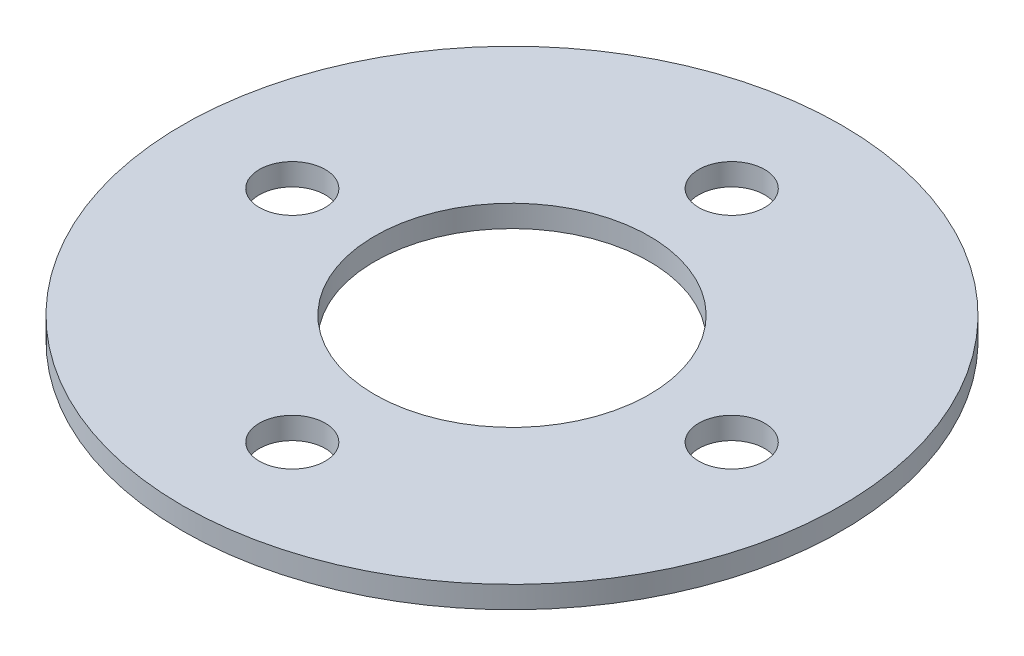
ISO-10303-21;
HEADER;
FILE_DESCRIPTION(('STEP AP214'),'2;1');
FILE_NAME('part.step','',(''),(''),'','','');
FILE_SCHEMA(('AUTOMOTIVE_DESIGN { 1 0 10303 214 1 1 1 1 }'));
ENDSEC;
DATA;
#1=APPLICATION_CONTEXT('core data for automotive mechanical design processes');
#2=APPLICATION_PROTOCOL_DEFINITION('international standard','automotive_design',2000,#1);
#3=PRODUCT_CONTEXT('',#1,'mechanical');
#4=PRODUCT('Part','Part','',(#3));
#5=PRODUCT_RELATED_PRODUCT_CATEGORY('part','',(#4));
#6=PRODUCT_DEFINITION_FORMATION('','',#4);
#7=PRODUCT_DEFINITION_CONTEXT('part definition',#1,'design');
#8=PRODUCT_DEFINITION('design','',#6,#7);
#9=PRODUCT_DEFINITION_SHAPE('','',#8);
#10=(LENGTH_UNIT() NAMED_UNIT(*) SI_UNIT(.MILLI.,.METRE.));
#11=(NAMED_UNIT(*) PLANE_ANGLE_UNIT() SI_UNIT($,.RADIAN.));
#12=(NAMED_UNIT(*) SI_UNIT($,.STERADIAN.) SOLID_ANGLE_UNIT());
#13=UNCERTAINTY_MEASURE_WITH_UNIT(LENGTH_MEASURE(1.E-05),#10,'distance_accuracy_value','');
#14=(GEOMETRIC_REPRESENTATION_CONTEXT(3) GLOBAL_UNCERTAINTY_ASSIGNED_CONTEXT((#13)) GLOBAL_UNIT_ASSIGNED_CONTEXT((#10,
#11,#12)) REPRESENTATION_CONTEXT('',''));
#15=CARTESIAN_POINT('',(0.,0.,0.));
#16=DIRECTION('',(0.,0.,1.));
#17=DIRECTION('',(1.,0.,0.));
#18=AXIS2_PLACEMENT_3D('',#15,#16,#17);
#19=CARTESIAN_POINT('',(0.,1.,0.));
#20=DIRECTION('',(0.,1.,0.));
#21=DIRECTION('',(0.,0.,1.));
#22=AXIS2_PLACEMENT_3D('',#19,#20,#21);
#23=PLANE('',#22);
#24=CARTESIAN_POINT('',(0.,1.,10.));
#25=DIRECTION('',(0.,1.,0.));
#26=DIRECTION('',(0.,0.,1.));
#27=AXIS2_PLACEMENT_3D('',#24,#25,#26);
#28=CIRCLE('',#27,1.5);
#29=CARTESIAN_POINT('',(0.,1.,11.5));
#30=VERTEX_POINT('',#29);
#31=EDGE_CURVE('E64',#30,#30,#28,.T.);
#32=ORIENTED_EDGE('',*,*,#31,.F.);
#33=EDGE_LOOP('',(#32));
#34=FACE_BOUND('',#33,.T.);
#35=CARTESIAN_POINT('',(0.,1.,-10.));
#36=DIRECTION('',(0.,1.,0.));
#37=DIRECTION('',(0.,0.,1.));
#38=AXIS2_PLACEMENT_3D('',#35,#36,#37);
#39=CIRCLE('',#38,1.5);
#40=CARTESIAN_POINT('',(0.,1.,-8.5));
#41=VERTEX_POINT('',#40);
#42=EDGE_CURVE('E52',#41,#41,#39,.T.);
#43=ORIENTED_EDGE('',*,*,#42,.F.);
#44=EDGE_LOOP('',(#43));
#45=FACE_BOUND('',#44,.T.);
#46=CARTESIAN_POINT('',(0.,1.,0.));
#47=DIRECTION('',(0.,1.,0.));
#48=DIRECTION('',(0.,0.,1.));
#49=AXIS2_PLACEMENT_3D('',#46,#47,#48);
#50=CIRCLE('',#49,15.);
#51=CARTESIAN_POINT('',(0.,1.,15.));
#52=VERTEX_POINT('',#51);
#53=EDGE_CURVE('E10',#52,#52,#50,.T.);
#54=ORIENTED_EDGE('',*,*,#53,.T.);
#55=EDGE_LOOP('',(#54));
#56=FACE_BOUND('',#55,.T.);
#57=CARTESIAN_POINT('',(0.,1.,0.));
#58=DIRECTION('',(0.,1.,0.));
#59=DIRECTION('',(0.,0.,1.));
#60=AXIS2_PLACEMENT_3D('',#57,#58,#59);
#61=CIRCLE('',#60,6.25);
#62=CARTESIAN_POINT('',(0.,1.,6.25));
#63=VERTEX_POINT('',#62);
#64=EDGE_CURVE('E47',#63,#63,#61,.T.);
#65=ORIENTED_EDGE('',*,*,#64,.F.);
#66=EDGE_LOOP('',(#65));
#67=FACE_BOUND('',#66,.T.);
#68=CARTESIAN_POINT('',(10.,1.,0.));
#69=DIRECTION('',(0.,1.,0.));
#70=DIRECTION('',(0.,0.,1.));
#71=AXIS2_PLACEMENT_3D('',#68,#69,#70);
#72=CIRCLE('',#71,1.5);
#73=CARTESIAN_POINT('',(10.,1.,1.50000000000003));
#74=VERTEX_POINT('',#73);
#75=EDGE_CURVE('E58',#74,#74,#72,.T.);
#76=ORIENTED_EDGE('',*,*,#75,.F.);
#77=EDGE_LOOP('',(#76));
#78=FACE_BOUND('',#77,.T.);
#79=CARTESIAN_POINT('',(-10.,1.,-1.04744440165294E-13));
#80=DIRECTION('',(0.,1.,0.));
#81=DIRECTION('',(0.,0.,1.));
#82=AXIS2_PLACEMENT_3D('',#79,#80,#81);
#83=CIRCLE('',#82,1.5);
#84=CARTESIAN_POINT('',(-10.,1.,1.49999999999989));
#85=VERTEX_POINT('',#84);
#86=EDGE_CURVE('E70',#85,#85,#83,.T.);
#87=ORIENTED_EDGE('',*,*,#86,.F.);
#88=EDGE_LOOP('',(#87));
#89=FACE_BOUND('',#88,.T.);
#90=ADVANCED_FACE('F36',(#34,#45,#56,#67,#78,#89),#23,.T.);
#91=CARTESIAN_POINT('',(0.,0.,0.));
#92=DIRECTION('',(0.,1.,0.));
#93=DIRECTION('',(0.,0.,1.));
#94=AXIS2_PLACEMENT_3D('',#91,#92,#93);
#95=PLANE('',#94);
#96=CARTESIAN_POINT('',(0.,0.,0.));
#97=DIRECTION('',(0.,1.,0.));
#98=DIRECTION('',(0.,0.,1.));
#99=AXIS2_PLACEMENT_3D('',#96,#97,#98);
#100=CIRCLE('',#99,15.);
#101=CARTESIAN_POINT('',(0.,0.,15.));
#102=VERTEX_POINT('',#101);
#103=EDGE_CURVE('E40',#102,#102,#100,.T.);
#104=ORIENTED_EDGE('',*,*,#103,.F.);
#105=EDGE_LOOP('',(#104));
#106=FACE_BOUND('',#105,.T.);
#107=CARTESIAN_POINT('',(0.,0.,0.));
#108=DIRECTION('',(0.,1.,0.));
#109=DIRECTION('',(0.,0.,1.));
#110=AXIS2_PLACEMENT_3D('',#107,#108,#109);
#111=CIRCLE('',#110,6.25);
#112=CARTESIAN_POINT('',(0.,0.,6.25));
#113=VERTEX_POINT('',#112);
#114=EDGE_CURVE('E49',#113,#113,#111,.T.);
#115=ORIENTED_EDGE('',*,*,#114,.T.);
#116=EDGE_LOOP('',(#115));
#117=FACE_BOUND('',#116,.T.);
#118=CARTESIAN_POINT('',(0.,0.,-10.));
#119=DIRECTION('',(0.,1.,0.));
#120=DIRECTION('',(0.,0.,1.));
#121=AXIS2_PLACEMENT_3D('',#118,#119,#120);
#122=CIRCLE('',#121,1.5);
#123=CARTESIAN_POINT('',(0.,0.,-8.5));
#124=VERTEX_POINT('',#123);
#125=EDGE_CURVE('E55',#124,#124,#122,.T.);
#126=ORIENTED_EDGE('',*,*,#125,.T.);
#127=EDGE_LOOP('',(#126));
#128=FACE_BOUND('',#127,.T.);
#129=CARTESIAN_POINT('',(10.,0.,0.));
#130=DIRECTION('',(0.,1.,0.));
#131=DIRECTION('',(0.,0.,1.));
#132=AXIS2_PLACEMENT_3D('',#129,#130,#131);
#133=CIRCLE('',#132,1.5);
#134=CARTESIAN_POINT('',(10.,0.,1.50000000000003));
#135=VERTEX_POINT('',#134);
#136=EDGE_CURVE('E61',#135,#135,#133,.T.);
#137=ORIENTED_EDGE('',*,*,#136,.T.);
#138=EDGE_LOOP('',(#137));
#139=FACE_BOUND('',#138,.T.);
#140=CARTESIAN_POINT('',(0.,0.,10.));
#141=DIRECTION('',(0.,1.,0.));
#142=DIRECTION('',(0.,0.,1.));
#143=AXIS2_PLACEMENT_3D('',#140,#141,#142);
#144=CIRCLE('',#143,1.5);
#145=CARTESIAN_POINT('',(0.,0.,11.5));
#146=VERTEX_POINT('',#145);
#147=EDGE_CURVE('E67',#146,#146,#144,.T.);
#148=ORIENTED_EDGE('',*,*,#147,.T.);
#149=EDGE_LOOP('',(#148));
#150=FACE_BOUND('',#149,.T.);
#151=CARTESIAN_POINT('',(-10.,0.,-1.04744440165294E-13));
#152=DIRECTION('',(0.,1.,0.));
#153=DIRECTION('',(0.,0.,1.));
#154=AXIS2_PLACEMENT_3D('',#151,#152,#153);
#155=CIRCLE('',#154,1.5);
#156=CARTESIAN_POINT('',(-10.,0.,1.49999999999989));
#157=VERTEX_POINT('',#156);
#158=EDGE_CURVE('E73',#157,#157,#155,.T.);
#159=ORIENTED_EDGE('',*,*,#158,.T.);
#160=EDGE_LOOP('',(#159));
#161=FACE_BOUND('',#160,.T.);
#162=ADVANCED_FACE('F83',(#106,#117,#128,#139,#150,#161),#95,.F.);
#163=CARTESIAN_POINT('',(0.,1.,0.));
#164=DIRECTION('',(0.,-1.,0.));
#165=DIRECTION('',(0.,0.,-1.));
#166=AXIS2_PLACEMENT_3D('',#163,#164,#165);
#167=CYLINDRICAL_SURFACE('',#166,15.);
#168=ORIENTED_EDGE('',*,*,#53,.F.);
#169=EDGE_LOOP('',(#168));
#170=FACE_BOUND('',#169,.T.);
#171=ORIENTED_EDGE('',*,*,#103,.T.);
#172=EDGE_LOOP('',(#171));
#173=FACE_BOUND('',#172,.T.);
#174=ADVANCED_FACE('F38',(#170,#173),#167,.T.);
#175=CARTESIAN_POINT('',(0.,1.,0.));
#176=DIRECTION('',(0.,-1.,0.));
#177=DIRECTION('',(0.,0.,-1.));
#178=AXIS2_PLACEMENT_3D('',#175,#176,#177);
#179=CYLINDRICAL_SURFACE('',#178,6.25);
#180=ORIENTED_EDGE('',*,*,#64,.T.);
#181=EDGE_LOOP('',(#180));
#182=FACE_BOUND('',#181,.T.);
#183=ORIENTED_EDGE('',*,*,#114,.F.);
#184=EDGE_LOOP('',(#183));
#185=FACE_BOUND('',#184,.T.);
#186=ADVANCED_FACE('F93',(#182,#185),#179,.F.);
#187=CARTESIAN_POINT('',(0.,1.,-10.));
#188=DIRECTION('',(0.,-1.,0.));
#189=DIRECTION('',(0.,0.,-1.));
#190=AXIS2_PLACEMENT_3D('',#187,#188,#189);
#191=CYLINDRICAL_SURFACE('',#190,1.5);
#192=ORIENTED_EDGE('',*,*,#42,.T.);
#193=EDGE_LOOP('',(#192));
#194=FACE_BOUND('',#193,.T.);
#195=ORIENTED_EDGE('',*,*,#125,.F.);
#196=EDGE_LOOP('',(#195));
#197=FACE_BOUND('',#196,.T.);
#198=ADVANCED_FACE('F96',(#194,#197),#191,.F.);
#199=CARTESIAN_POINT('',(10.,1.,0.));
#200=DIRECTION('',(0.,-1.,0.));
#201=DIRECTION('',(0.,0.,-1.));
#202=AXIS2_PLACEMENT_3D('',#199,#200,#201);
#203=CYLINDRICAL_SURFACE('',#202,1.5);
#204=ORIENTED_EDGE('',*,*,#75,.T.);
#205=EDGE_LOOP('',(#204));
#206=FACE_BOUND('',#205,.T.);
#207=ORIENTED_EDGE('',*,*,#136,.F.);
#208=EDGE_LOOP('',(#207));
#209=FACE_BOUND('',#208,.T.);
#210=ADVANCED_FACE('F100',(#206,#209),#203,.F.);
#211=CARTESIAN_POINT('',(0.,1.,10.));
#212=DIRECTION('',(0.,-1.,0.));
#213=DIRECTION('',(0.,0.,-1.));
#214=AXIS2_PLACEMENT_3D('',#211,#212,#213);
#215=CYLINDRICAL_SURFACE('',#214,1.5);
#216=ORIENTED_EDGE('',*,*,#31,.T.);
#217=EDGE_LOOP('',(#216));
#218=FACE_BOUND('',#217,.T.);
#219=ORIENTED_EDGE('',*,*,#147,.F.);
#220=EDGE_LOOP('',(#219));
#221=FACE_BOUND('',#220,.T.);
#222=ADVANCED_FACE('F104',(#218,#221),#215,.F.);
#223=CARTESIAN_POINT('',(-10.,1.,-1.04744440165294E-13));
#224=DIRECTION('',(0.,-1.,0.));
#225=DIRECTION('',(0.,0.,-1.));
#226=AXIS2_PLACEMENT_3D('',#223,#224,#225);
#227=CYLINDRICAL_SURFACE('',#226,1.5);
#228=ORIENTED_EDGE('',*,*,#86,.T.);
#229=EDGE_LOOP('',(#228));
#230=FACE_BOUND('',#229,.T.);
#231=ORIENTED_EDGE('',*,*,#158,.F.);
#232=EDGE_LOOP('',(#231));
#233=FACE_BOUND('',#232,.T.);
#234=ADVANCED_FACE('F79',(#230,#233),#227,.F.);
#235=CLOSED_SHELL('',(#90,#162,#174,#186,#198,#210,#222,#234));
#236=MANIFOLD_SOLID_BREP('B2',#235);
#237=ADVANCED_BREP_SHAPE_REPRESENTATION('',(#18,#236),#14);
#238=SHAPE_DEFINITION_REPRESENTATION(#9,#237);
ENDSEC;
END-ISO-10303-21;
